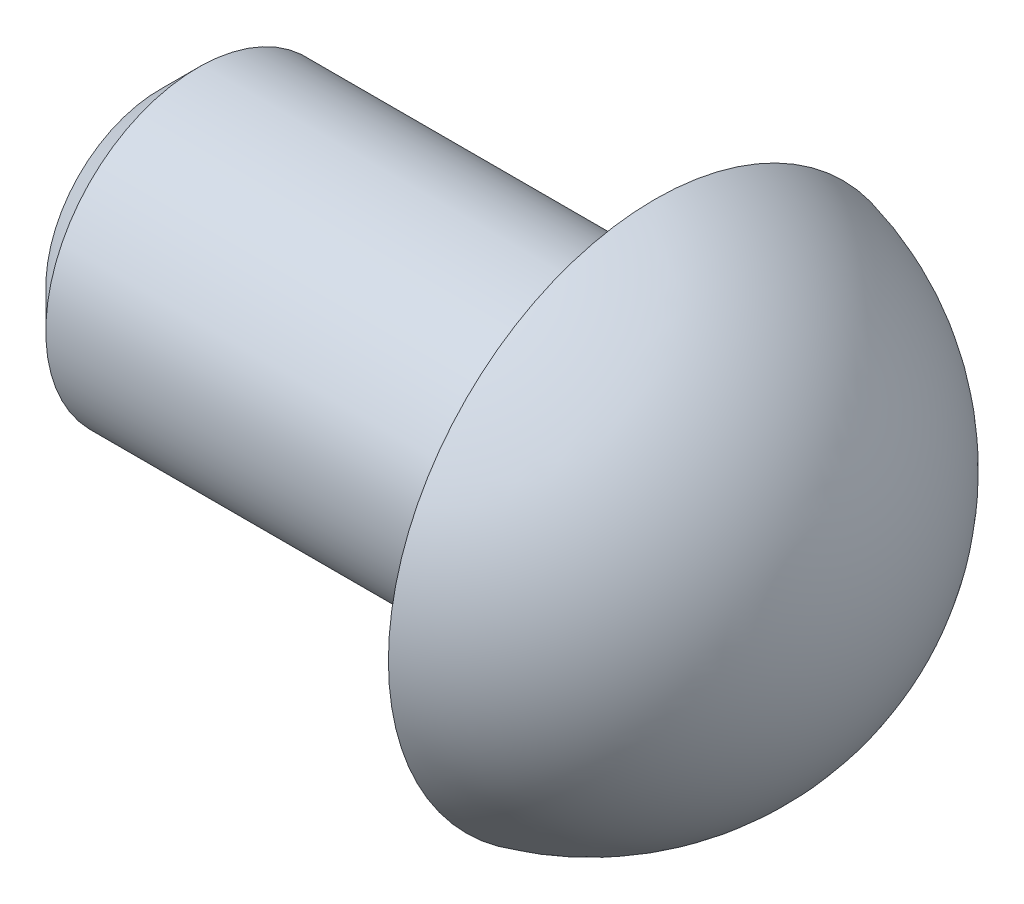
ISO-10303-21;
HEADER;
FILE_DESCRIPTION(('STEP AP214'),'2;1');
FILE_NAME('part.step','',(''),(''),'','','');
FILE_SCHEMA(('AUTOMOTIVE_DESIGN { 1 0 10303 214 1 1 1 1 }'));
ENDSEC;
DATA;
#1=APPLICATION_CONTEXT('core data for automotive mechanical design processes');
#2=APPLICATION_PROTOCOL_DEFINITION('international standard','automotive_design',2000,#1);
#3=PRODUCT_CONTEXT('',#1,'mechanical');
#4=PRODUCT('Part','Part','',(#3));
#5=PRODUCT_RELATED_PRODUCT_CATEGORY('part','',(#4));
#6=PRODUCT_DEFINITION_FORMATION('','',#4);
#7=PRODUCT_DEFINITION_CONTEXT('part definition',#1,'design');
#8=PRODUCT_DEFINITION('design','',#6,#7);
#9=PRODUCT_DEFINITION_SHAPE('','',#8);
#10=(LENGTH_UNIT() NAMED_UNIT(*) SI_UNIT(.MILLI.,.METRE.));
#11=(NAMED_UNIT(*) PLANE_ANGLE_UNIT() SI_UNIT($,.RADIAN.));
#12=(NAMED_UNIT(*) SI_UNIT($,.STERADIAN.) SOLID_ANGLE_UNIT());
#13=UNCERTAINTY_MEASURE_WITH_UNIT(LENGTH_MEASURE(1.E-05),#10,'distance_accuracy_value','');
#14=(GEOMETRIC_REPRESENTATION_CONTEXT(3) GLOBAL_UNCERTAINTY_ASSIGNED_CONTEXT((#13)) GLOBAL_UNIT_ASSIGNED_CONTEXT((#10,
#11,#12)) REPRESENTATION_CONTEXT('',''));
#15=CARTESIAN_POINT('',(0.,0.,0.));
#16=DIRECTION('',(0.,0.,1.));
#17=DIRECTION('',(1.,0.,0.));
#18=AXIS2_PLACEMENT_3D('',#15,#16,#17);
#19=CARTESIAN_POINT('',(-6.5,0.,0.));
#20=DIRECTION('',(1.,0.,0.));
#21=DIRECTION('',(0.,0.,-1.));
#22=AXIS2_PLACEMENT_3D('',#19,#20,#21);
#23=CYLINDRICAL_SURFACE('',#22,2.);
#24=CARTESIAN_POINT('',(-6.,0.,0.));
#25=DIRECTION('',(1.,0.,0.));
#26=DIRECTION('',(0.,0.,-1.));
#27=AXIS2_PLACEMENT_3D('',#24,#25,#26);
#28=CIRCLE('',#27,2.);
#29=CARTESIAN_POINT('',(-6.,0.,-2.));
#30=VERTEX_POINT('',#29);
#31=EDGE_CURVE('E38',#30,#30,#28,.T.);
#32=CARTESIAN_POINT('',(0.,0.,0.));
#33=DIRECTION('',(1.,0.,0.));
#34=DIRECTION('',(0.,0.,-1.));
#35=AXIS2_PLACEMENT_3D('',#32,#33,#34);
#36=CIRCLE('',#35,2.);
#37=CARTESIAN_POINT('',(0.,0.,-2.));
#38=VERTEX_POINT('',#37);
#39=EDGE_CURVE('E42',#38,#38,#36,.T.);
#40=CARTESIAN_POINT('',(-6.,0.,-2.));
#41=CARTESIAN_POINT('',(-5.9375,0.,-2.));
#42=CARTESIAN_POINT('',(-5.875,0.,-2.));
#43=CARTESIAN_POINT('',(-5.75,0.,-2.));
#44=CARTESIAN_POINT('',(-5.6875,0.,-2.));
#45=CARTESIAN_POINT('',(-5.5625,0.,-2.));
#46=CARTESIAN_POINT('',(-5.5,0.,-2.));
#47=CARTESIAN_POINT('',(-5.375,0.,-2.));
#48=CARTESIAN_POINT('',(-5.3125,0.,-2.));
#49=CARTESIAN_POINT('',(-5.1875,0.,-2.));
#50=CARTESIAN_POINT('',(-5.125,0.,-2.));
#51=CARTESIAN_POINT('',(-5.,0.,-2.));
#52=CARTESIAN_POINT('',(-4.9375,0.,-2.));
#53=CARTESIAN_POINT('',(-4.8125,0.,-2.));
#54=CARTESIAN_POINT('',(-4.75,0.,-2.));
#55=CARTESIAN_POINT('',(-4.625,0.,-2.));
#56=CARTESIAN_POINT('',(-4.5625,0.,-2.));
#57=CARTESIAN_POINT('',(-4.4375,0.,-2.));
#58=CARTESIAN_POINT('',(-4.375,0.,-2.));
#59=CARTESIAN_POINT('',(-4.25,0.,-2.));
#60=CARTESIAN_POINT('',(-4.1875,0.,-2.));
#61=CARTESIAN_POINT('',(-4.0625,0.,-2.));
#62=CARTESIAN_POINT('',(-4.,0.,-2.));
#63=CARTESIAN_POINT('',(-3.875,0.,-2.));
#64=CARTESIAN_POINT('',(-3.8125,0.,-2.));
#65=CARTESIAN_POINT('',(-3.6875,0.,-2.));
#66=CARTESIAN_POINT('',(-3.625,0.,-2.));
#67=CARTESIAN_POINT('',(-3.5,0.,-2.));
#68=CARTESIAN_POINT('',(-3.4375,0.,-2.));
#69=CARTESIAN_POINT('',(-3.3125,0.,-2.));
#70=CARTESIAN_POINT('',(-3.25,0.,-2.));
#71=CARTESIAN_POINT('',(-3.125,0.,-2.));
#72=CARTESIAN_POINT('',(-3.0625,0.,-2.));
#73=CARTESIAN_POINT('',(-2.9375,0.,-2.));
#74=CARTESIAN_POINT('',(-2.875,0.,-2.));
#75=CARTESIAN_POINT('',(-2.75,0.,-2.));
#76=CARTESIAN_POINT('',(-2.6875,0.,-2.));
#77=CARTESIAN_POINT('',(-2.5625,0.,-2.));
#78=CARTESIAN_POINT('',(-2.5,0.,-2.));
#79=CARTESIAN_POINT('',(-2.375,0.,-2.));
#80=CARTESIAN_POINT('',(-2.3125,0.,-2.));
#81=CARTESIAN_POINT('',(-2.1875,0.,-2.));
#82=CARTESIAN_POINT('',(-2.125,0.,-2.));
#83=CARTESIAN_POINT('',(-2.,0.,-2.));
#84=CARTESIAN_POINT('',(-1.9375,0.,-2.));
#85=CARTESIAN_POINT('',(-1.8125,0.,-2.));
#86=CARTESIAN_POINT('',(-1.75,0.,-2.));
#87=CARTESIAN_POINT('',(-1.625,0.,-2.));
#88=CARTESIAN_POINT('',(-1.5625,0.,-2.));
#89=CARTESIAN_POINT('',(-1.4375,0.,-2.));
#90=CARTESIAN_POINT('',(-1.375,0.,-2.));
#91=CARTESIAN_POINT('',(-1.25,0.,-2.));
#92=CARTESIAN_POINT('',(-1.1875,0.,-2.));
#93=CARTESIAN_POINT('',(-1.0625,0.,-2.));
#94=CARTESIAN_POINT('',(-0.999999999999999,0.,-2.));
#95=CARTESIAN_POINT('',(-0.874999999999999,0.,-2.));
#96=CARTESIAN_POINT('',(-0.8125,0.,-2.));
#97=CARTESIAN_POINT('',(-0.6875,0.,-2.));
#98=CARTESIAN_POINT('',(-0.625,0.,-2.));
#99=CARTESIAN_POINT('',(-0.5,0.,-2.));
#100=CARTESIAN_POINT('',(-0.4375,0.,-2.));
#101=CARTESIAN_POINT('',(-0.3125,0.,-2.));
#102=CARTESIAN_POINT('',(-0.25,0.,-2.));
#103=CARTESIAN_POINT('',(-0.125,0.,-2.));
#104=CARTESIAN_POINT('',(-0.0625000000000001,0.,-2.));
#105=CARTESIAN_POINT('',(0.,0.,-2.));
#106=B_SPLINE_CURVE_WITH_KNOTS('',3,(#40,#41,#42,#43,#44,#45,#46,#47,#48,#49,#50,#51,#52,#53,
#54,#55,#56,#57,#58,#59,#60,#61,#62,#63,#64,#65,#66,#67,#68,#69,#70,#71,#72,#73,#74,#75,#76,#77,
#78,#79,#80,#81,#82,#83,#84,#85,#86,#87,#88,#89,#90,#91,#92,#93,#94,#95,#96,#97,#98,#99,#100,
#101,#102,#103,#104,#105),.UNSPECIFIED.,.F.,.F.,(4,2,2,2,2,2,2,2,2,2,2,2,2,2,2,2,2,2,2,2,2,2,2,
2,2,2,2,2,2,2,2,2,4),(0.,0.187499999999999,0.374999999999999,0.5625,0.749999999999999,
0.937499999999999,1.125,1.3125,1.5,1.6875,1.875,2.0625,2.25,2.4375,2.625,2.8125,3.,3.1875,3.375,
3.5625,3.75,3.9375,4.125,4.3125,4.5,4.6875,4.875,5.0625,5.25,5.4375,5.625,5.8125,6.),.UNSPECIFIED.);
#107=EDGE_CURVE('BSEAM31',#30,#38,#106,.T.);
#108=ORIENTED_EDGE('',*,*,#31,.T.);
#109=ORIENTED_EDGE('',*,*,#39,.F.);
#110=ORIENTED_EDGE('',*,*,#107,.T.);
#111=ORIENTED_EDGE('',*,*,#107,.F.);
#112=EDGE_LOOP('',(#108,#110,#109,#111));
#113=FACE_BOUND('',#112,.T.);
#114=ADVANCED_FACE('F31',(#113),#23,.T.);
#115=CARTESIAN_POINT('',(-6.5,0.,0.));
#116=DIRECTION('',(1.,0.,0.));
#117=DIRECTION('',(0.,0.,-1.));
#118=AXIS2_PLACEMENT_3D('',#115,#116,#117);
#119=PLANE('',#118);
#120=CARTESIAN_POINT('',(-6.5,0.,0.));
#121=DIRECTION('',(1.,0.,0.));
#122=DIRECTION('',(0.,0.,-1.));
#123=AXIS2_PLACEMENT_3D('',#120,#121,#122);
#124=CIRCLE('',#123,1.49999999999999);
#125=CARTESIAN_POINT('',(-6.5,0.,-1.49999999999999));
#126=VERTEX_POINT('',#125);
#127=EDGE_CURVE('E10',#126,#126,#124,.F.);
#128=ORIENTED_EDGE('',*,*,#127,.T.);
#129=EDGE_LOOP('',(#128));
#130=FACE_BOUND('',#129,.T.);
#131=ADVANCED_FACE('F56',(#130),#119,.F.);
#132=CARTESIAN_POINT('',(-0.842614977317635,0.,0.));
#133=DIRECTION('',(-1.,0.,0.));
#134=DIRECTION('',(0.,0.,1.));
#135=AXIS2_PLACEMENT_3D('',#132,#133,#134);
#136=SPHERICAL_SURFACE('',#135,3.6);
#137=CARTESIAN_POINT('',(0.,0.,0.));
#138=DIRECTION('',(-1.,0.,0.));
#139=DIRECTION('',(0.,0.,1.));
#140=AXIS2_PLACEMENT_3D('',#137,#138,#139);
#141=CIRCLE('',#140,3.5);
#142=CARTESIAN_POINT('',(0.,0.,3.5));
#143=VERTEX_POINT('',#142);
#144=EDGE_CURVE('E46',#143,#143,#141,.T.);
#145=ORIENTED_EDGE('',*,*,#144,.F.);
#146=EDGE_LOOP('',(#145));
#147=FACE_BOUND('',#146,.T.);
#148=ADVANCED_FACE('F54',(#147),#136,.T.);
#149=CARTESIAN_POINT('',(0.,0.,3.5));
#150=DIRECTION('',(-1.,0.,0.));
#151=DIRECTION('',(0.,0.,1.));
#152=AXIS2_PLACEMENT_3D('',#149,#150,#151);
#153=PLANE('',#152);
#154=ORIENTED_EDGE('',*,*,#39,.T.);
#155=EDGE_LOOP('',(#154));
#156=FACE_BOUND('',#155,.T.);
#157=ORIENTED_EDGE('',*,*,#144,.T.);
#158=EDGE_LOOP('',(#157));
#159=FACE_BOUND('',#158,.T.);
#160=ADVANCED_FACE('F52',(#156,#159),#153,.T.);
#161=CARTESIAN_POINT('',(-6.,0.,0.));
#162=DIRECTION('',(1.,0.,0.));
#163=DIRECTION('',(0.,0.,-1.));
#164=AXIS2_PLACEMENT_3D('',#161,#162,#163);
#165=CONICAL_SURFACE('',#164,2.,0.78539816339745);
#166=ORIENTED_EDGE('',*,*,#127,.F.);
#167=EDGE_LOOP('',(#166));
#168=FACE_BOUND('',#167,.T.);
#169=ORIENTED_EDGE('',*,*,#31,.F.);
#170=EDGE_LOOP('',(#169));
#171=FACE_BOUND('',#170,.T.);
#172=ADVANCED_FACE('F33',(#168,#171),#165,.T.);
#173=CLOSED_SHELL('',(#114,#131,#148,#160,#172));
#174=MANIFOLD_SOLID_BREP('B2',#173);
#175=ADVANCED_BREP_SHAPE_REPRESENTATION('',(#18,#174),#14);
#176=SHAPE_DEFINITION_REPRESENTATION(#9,#175);
ENDSEC;
END-ISO-10303-21;
